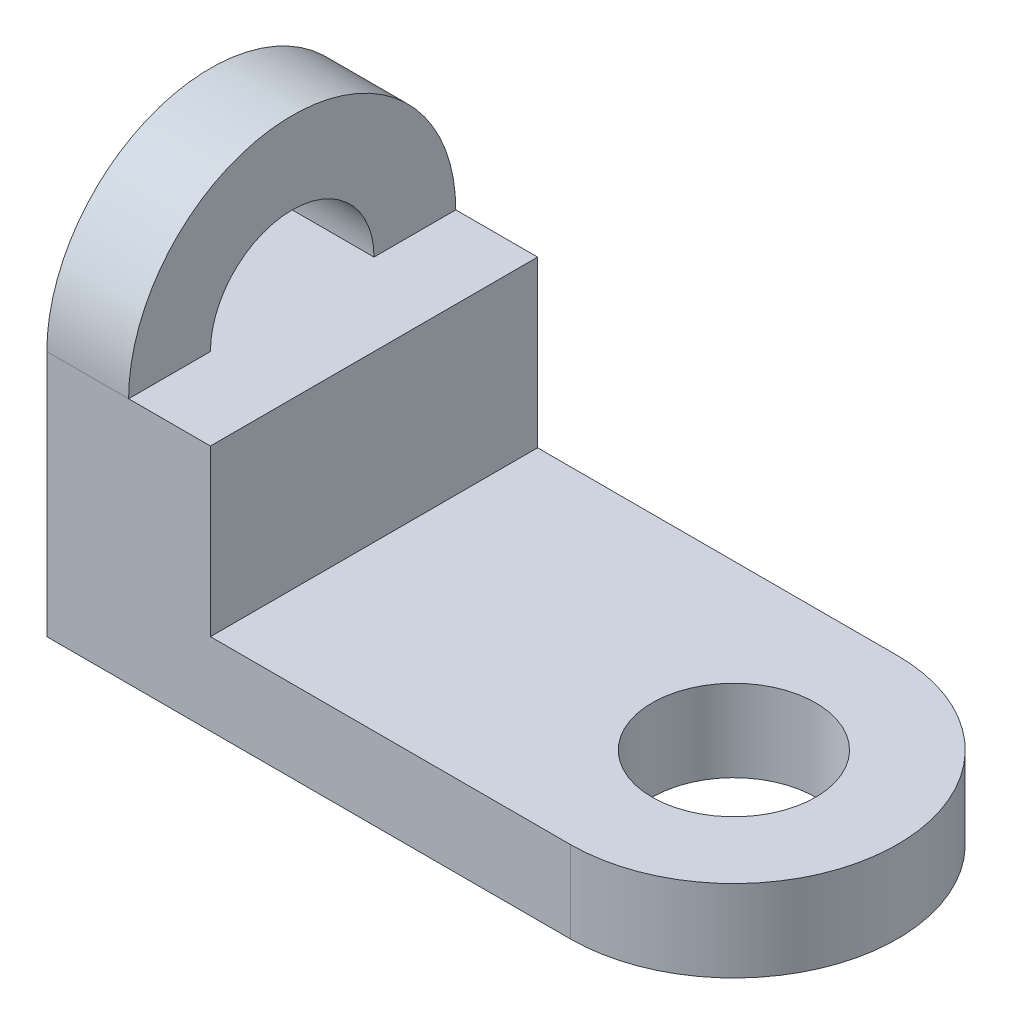
ISO-10303-21;
HEADER;
FILE_DESCRIPTION(('STEP AP214'),'2;1');
FILE_NAME('part.step','',(''),(''),'','','');
FILE_SCHEMA(('AUTOMOTIVE_DESIGN { 1 0 10303 214 1 1 1 1 }'));
ENDSEC;
DATA;
#1=APPLICATION_CONTEXT('core data for automotive mechanical design processes');
#2=APPLICATION_PROTOCOL_DEFINITION('international standard','automotive_design',2000,#1);
#3=PRODUCT_CONTEXT('',#1,'mechanical');
#4=PRODUCT('Part','Part','',(#3));
#5=PRODUCT_RELATED_PRODUCT_CATEGORY('part','',(#4));
#6=PRODUCT_DEFINITION_FORMATION('','',#4);
#7=PRODUCT_DEFINITION_CONTEXT('part definition',#1,'design');
#8=PRODUCT_DEFINITION('design','',#6,#7);
#9=PRODUCT_DEFINITION_SHAPE('','',#8);
#10=(LENGTH_UNIT() NAMED_UNIT(*) SI_UNIT(.MILLI.,.METRE.));
#11=(NAMED_UNIT(*) PLANE_ANGLE_UNIT() SI_UNIT($,.RADIAN.));
#12=(NAMED_UNIT(*) SI_UNIT($,.STERADIAN.) SOLID_ANGLE_UNIT());
#13=UNCERTAINTY_MEASURE_WITH_UNIT(LENGTH_MEASURE(1.E-05),#10,'distance_accuracy_value','');
#14=(GEOMETRIC_REPRESENTATION_CONTEXT(3) GLOBAL_UNCERTAINTY_ASSIGNED_CONTEXT((#13)) GLOBAL_UNIT_ASSIGNED_CONTEXT((#10,
#11,#12)) REPRESENTATION_CONTEXT('',''));
#15=CARTESIAN_POINT('',(0.,0.,0.));
#16=DIRECTION('',(0.,0.,1.));
#17=DIRECTION('',(1.,0.,0.));
#18=AXIS2_PLACEMENT_3D('',#15,#16,#17);
#19=CARTESIAN_POINT('',(0.,766.826,0.));
#20=DIRECTION('',(0.,-1.,0.));
#21=DIRECTION('',(0.,0.,-1.));
#22=AXIS2_PLACEMENT_3D('',#19,#20,#21);
#23=PLANE('',#22);
#24=DIRECTION('',(0.,0.,-1.));
#25=VECTOR('',#24,1.);
#26=CARTESIAN_POINT('',(-1371.6,766.826,2.99760216648792E-13));
#27=LINE('',#26,#25);
#28=CARTESIAN_POINT('',(-1371.6,766.826,508.));
#29=VERTEX_POINT('',#28);
#30=CARTESIAN_POINT('',(-1371.6,766.826,254.));
#31=VERTEX_POINT('',#30);
#32=EDGE_CURVE('E11',#29,#31,#27,.T.);
#33=ORIENTED_EDGE('',*,*,#32,.F.);
#34=DIRECTION('',(1.,0.,0.));
#35=VECTOR('',#34,1.);
#36=CARTESIAN_POINT('',(-1625.6,766.826,508.));
#37=LINE('',#36,#35);
#38=CARTESIAN_POINT('',(-1117.6,766.826,508.));
#39=VERTEX_POINT('',#38);
#40=EDGE_CURVE('E122',#29,#39,#37,.T.);
#41=ORIENTED_EDGE('',*,*,#40,.T.);
#42=DIRECTION('',(0.,0.,1.));
#43=VECTOR('',#42,1.);
#44=CARTESIAN_POINT('',(-1117.6,766.826,-508.));
#45=LINE('',#44,#43);
#46=CARTESIAN_POINT('',(-1117.6,766.826,-508.));
#47=VERTEX_POINT('',#46);
#48=EDGE_CURVE('E132',#47,#39,#45,.T.);
#49=ORIENTED_EDGE('',*,*,#48,.F.);
#50=DIRECTION('',(1.,0.,0.));
#51=VECTOR('',#50,1.);
#52=CARTESIAN_POINT('',(-1625.6,766.826,-508.));
#53=LINE('',#52,#51);
#54=CARTESIAN_POINT('',(-1371.6,766.826,-508.));
#55=VERTEX_POINT('',#54);
#56=EDGE_CURVE('E141',#55,#47,#53,.T.);
#57=ORIENTED_EDGE('',*,*,#56,.F.);
#58=CARTESIAN_POINT('',(-1371.6,766.826,-254.));
#59=VERTEX_POINT('',#58);
#60=EDGE_CURVE('E42',#59,#55,#27,.T.);
#61=ORIENTED_EDGE('',*,*,#60,.F.);
#62=DIRECTION('',(-1.,0.,0.));
#63=VECTOR('',#62,1.);
#64=CARTESIAN_POINT('',(-1371.6,766.826,-254.));
#65=LINE('',#64,#63);
#66=CARTESIAN_POINT('',(-1625.6,766.826,-254.));
#67=VERTEX_POINT('',#66);
#68=EDGE_CURVE('E178',#59,#67,#65,.T.);
#69=ORIENTED_EDGE('',*,*,#68,.T.);
#70=DIRECTION('',(0.,0.,1.));
#71=VECTOR('',#70,1.);
#72=CARTESIAN_POINT('',(-1625.6,766.826,-508.));
#73=LINE('',#72,#71);
#74=CARTESIAN_POINT('',(-1625.6,766.826,254.));
#75=VERTEX_POINT('',#74);
#76=EDGE_CURVE('E121',#67,#75,#73,.T.);
#77=ORIENTED_EDGE('',*,*,#76,.T.);
#78=DIRECTION('',(-1.,0.,0.));
#79=VECTOR('',#78,1.);
#80=CARTESIAN_POINT('',(-1371.6,766.826,254.));
#81=LINE('',#80,#79);
#82=EDGE_CURVE('E37',#75,#31,#81,.F.);
#83=ORIENTED_EDGE('',*,*,#82,.T.);
#84=EDGE_LOOP('',(#33,#41,#49,#57,#61,#69,#77,#83));
#85=FACE_BOUND('',#84,.T.);
#86=ADVANCED_FACE('F33',(#85),#23,.F.);
#87=CARTESIAN_POINT('',(0.,254.,0.));
#88=DIRECTION('',(0.,1.,0.));
#89=DIRECTION('',(0.,0.,1.));
#90=AXIS2_PLACEMENT_3D('',#87,#88,#89);
#91=PLANE('',#90);
#92=CARTESIAN_POINT('',(0.,254.,0.));
#93=DIRECTION('',(0.,1.,0.));
#94=DIRECTION('',(0.,0.,1.));
#95=AXIS2_PLACEMENT_3D('',#92,#93,#94);
#96=CIRCLE('',#95,254.);
#97=CARTESIAN_POINT('',(0.,254.,254.));
#98=VERTEX_POINT('',#97);
#99=EDGE_CURVE('E145',#98,#98,#96,.T.);
#100=ORIENTED_EDGE('',*,*,#99,.F.);
#101=EDGE_LOOP('',(#100));
#102=FACE_BOUND('',#101,.T.);
#103=DIRECTION('',(-1.,0.,0.));
#104=VECTOR('',#103,1.);
#105=CARTESIAN_POINT('',(-1.0796777190076E-13,254.,-508.));
#106=LINE('',#105,#104);
#107=CARTESIAN_POINT('',(-1.0796777190076E-13,254.,-508.));
#108=VERTEX_POINT('',#107);
#109=CARTESIAN_POINT('',(-1117.6,254.,-508.));
#110=VERTEX_POINT('',#109);
#111=EDGE_CURVE('E154',#108,#110,#106,.T.);
#112=ORIENTED_EDGE('',*,*,#111,.T.);
#113=DIRECTION('',(0.,0.,1.));
#114=VECTOR('',#113,1.);
#115=CARTESIAN_POINT('',(-1117.6,254.,-508.));
#116=LINE('',#115,#114);
#117=CARTESIAN_POINT('',(-1117.6,254.,508.));
#118=VERTEX_POINT('',#117);
#119=EDGE_CURVE('E110',#110,#118,#116,.T.);
#120=ORIENTED_EDGE('',*,*,#119,.T.);
#121=DIRECTION('',(1.,0.,0.));
#122=VECTOR('',#121,1.);
#123=CARTESIAN_POINT('',(-1625.6,254.,508.));
#124=LINE('',#123,#122);
#125=CARTESIAN_POINT('',(0.,254.,508.));
#126=VERTEX_POINT('',#125);
#127=EDGE_CURVE('E158',#118,#126,#124,.T.);
#128=ORIENTED_EDGE('',*,*,#127,.T.);
#129=CARTESIAN_POINT('',(0.,254.,0.));
#130=DIRECTION('',(0.,1.,0.));
#131=DIRECTION('',(0.,0.,1.));
#132=AXIS2_PLACEMENT_3D('',#129,#130,#131);
#133=CIRCLE('',#132,508.);
#134=EDGE_CURVE('E151',#126,#108,#133,.T.);
#135=ORIENTED_EDGE('',*,*,#134,.T.);
#136=EDGE_LOOP('',(#112,#120,#128,#135));
#137=FACE_BOUND('',#136,.T.);
#138=ADVANCED_FACE('F194',(#102,#137),#91,.T.);
#139=CARTESIAN_POINT('',(0.,0.,0.));
#140=DIRECTION('',(0.,1.,0.));
#141=DIRECTION('',(0.,0.,1.));
#142=AXIS2_PLACEMENT_3D('',#139,#140,#141);
#143=PLANE('',#142);
#144=DIRECTION('',(0.,0.,1.));
#145=VECTOR('',#144,1.);
#146=CARTESIAN_POINT('',(-1625.6,0.,-508.));
#147=LINE('',#146,#145);
#148=CARTESIAN_POINT('',(-1625.6,0.,-508.));
#149=VERTEX_POINT('',#148);
#150=CARTESIAN_POINT('',(-1625.6,0.,508.));
#151=VERTEX_POINT('',#150);
#152=EDGE_CURVE('E165',#149,#151,#147,.T.);
#153=ORIENTED_EDGE('',*,*,#152,.F.);
#154=DIRECTION('',(-1.,0.,0.));
#155=VECTOR('',#154,1.);
#156=CARTESIAN_POINT('',(-1.0796777190076E-13,0.,-508.));
#157=LINE('',#156,#155);
#158=CARTESIAN_POINT('',(-1.0796777190076E-13,0.,-508.));
#159=VERTEX_POINT('',#158);
#160=EDGE_CURVE('E163',#159,#149,#157,.T.);
#161=ORIENTED_EDGE('',*,*,#160,.F.);
#162=CARTESIAN_POINT('',(0.,0.,0.));
#163=DIRECTION('',(0.,1.,0.));
#164=DIRECTION('',(0.,0.,1.));
#165=AXIS2_PLACEMENT_3D('',#162,#163,#164);
#166=CIRCLE('',#165,508.);
#167=CARTESIAN_POINT('',(0.,0.,508.));
#168=VERTEX_POINT('',#167);
#169=EDGE_CURVE('E148',#168,#159,#166,.T.);
#170=ORIENTED_EDGE('',*,*,#169,.F.);
#171=DIRECTION('',(1.,0.,0.));
#172=VECTOR('',#171,1.);
#173=CARTESIAN_POINT('',(-1625.6,0.,508.));
#174=LINE('',#173,#172);
#175=EDGE_CURVE('E155',#151,#168,#174,.T.);
#176=ORIENTED_EDGE('',*,*,#175,.F.);
#177=EDGE_LOOP('',(#153,#161,#170,#176));
#178=FACE_BOUND('',#177,.T.);
#179=CARTESIAN_POINT('',(0.,0.,0.));
#180=DIRECTION('',(0.,1.,0.));
#181=DIRECTION('',(0.,0.,1.));
#182=AXIS2_PLACEMENT_3D('',#179,#180,#181);
#183=CIRCLE('',#182,254.);
#184=CARTESIAN_POINT('',(0.,0.,254.));
#185=VERTEX_POINT('',#184);
#186=EDGE_CURVE('E143',#185,#185,#183,.T.);
#187=ORIENTED_EDGE('',*,*,#186,.T.);
#188=EDGE_LOOP('',(#187));
#189=FACE_BOUND('',#188,.T.);
#190=ADVANCED_FACE('F203',(#178,#189),#143,.F.);
#191=CARTESIAN_POINT('',(0.,254.,0.));
#192=DIRECTION('',(0.,-1.,0.));
#193=DIRECTION('',(0.,0.,-1.));
#194=AXIS2_PLACEMENT_3D('',#191,#192,#193);
#195=CYLINDRICAL_SURFACE('',#194,508.);
#196=ORIENTED_EDGE('',*,*,#169,.T.);
#197=DIRECTION('',(0.,-1.,0.));
#198=VECTOR('',#197,1.);
#199=CARTESIAN_POINT('',(-1.0796777190076E-13,254.,-508.));
#200=LINE('',#199,#198);
#201=EDGE_CURVE('E175',#108,#159,#200,.T.);
#202=ORIENTED_EDGE('',*,*,#201,.F.);
#203=ORIENTED_EDGE('',*,*,#134,.F.);
#204=DIRECTION('',(0.,-1.,0.));
#205=VECTOR('',#204,1.);
#206=CARTESIAN_POINT('',(0.,254.,508.));
#207=LINE('',#206,#205);
#208=EDGE_CURVE('E160',#126,#168,#207,.T.);
#209=ORIENTED_EDGE('',*,*,#208,.T.);
#210=EDGE_LOOP('',(#196,#202,#203,#209));
#211=FACE_BOUND('',#210,.T.);
#212=ADVANCED_FACE('F35',(#211),#195,.T.);
#213=CARTESIAN_POINT('',(-1.0796777190076E-13,254.,-508.));
#214=DIRECTION('',(0.,0.,1.));
#215=DIRECTION('',(1.,0.,0.));
#216=AXIS2_PLACEMENT_3D('',#213,#214,#215);
#217=PLANE('',#216);
#218=CARTESIAN_POINT('',(-1625.6,766.826,-507.999999999999));
#219=VERTEX_POINT('',#218);
#220=EDGE_CURVE('E133',#219,#55,#53,.T.);
#221=ORIENTED_EDGE('',*,*,#220,.T.);
#222=ORIENTED_EDGE('',*,*,#56,.T.);
#223=DIRECTION('',(0.,-1.,0.));
#224=VECTOR('',#223,1.);
#225=CARTESIAN_POINT('',(-1117.6,766.826,-508.));
#226=LINE('',#225,#224);
#227=EDGE_CURVE('E138',#47,#110,#226,.T.);
#228=ORIENTED_EDGE('',*,*,#227,.T.);
#229=ORIENTED_EDGE('',*,*,#111,.F.);
#230=ORIENTED_EDGE('',*,*,#201,.T.);
#231=ORIENTED_EDGE('',*,*,#160,.T.);
#232=DIRECTION('',(0.,-1.,0.));
#233=VECTOR('',#232,1.);
#234=CARTESIAN_POINT('',(-1625.6,254.,-508.));
#235=LINE('',#234,#233);
#236=EDGE_CURVE('E172',#219,#149,#235,.T.);
#237=ORIENTED_EDGE('',*,*,#236,.F.);
#238=EDGE_LOOP('',(#221,#222,#228,#229,#230,#231,#237));
#239=FACE_BOUND('',#238,.T.);
#240=ADVANCED_FACE('F189',(#239),#217,.F.);
#241=CARTESIAN_POINT('',(-1625.6,254.,-508.));
#242=DIRECTION('',(1.,0.,0.));
#243=DIRECTION('',(0.,0.,-1.));
#244=AXIS2_PLACEMENT_3D('',#241,#242,#243);
#245=PLANE('',#244);
#246=DIRECTION('',(0.,-1.,0.));
#247=VECTOR('',#246,1.);
#248=CARTESIAN_POINT('',(-1625.6,254.,508.));
#249=LINE('',#248,#247);
#250=CARTESIAN_POINT('',(-1625.6,766.826,508.));
#251=VERTEX_POINT('',#250);
#252=EDGE_CURVE('E170',#251,#151,#249,.T.);
#253=ORIENTED_EDGE('',*,*,#252,.F.);
#254=CARTESIAN_POINT('',(-1625.6,766.826,4.66293670342566E-13));
#255=DIRECTION('',(1.,0.,0.));
#256=DIRECTION('',(0.,0.,1.));
#257=AXIS2_PLACEMENT_3D('',#254,#255,#256);
#258=CIRCLE('',#257,508.);
#259=EDGE_CURVE('E111',#219,#251,#258,.T.);
#260=ORIENTED_EDGE('',*,*,#259,.F.);
#261=ORIENTED_EDGE('',*,*,#236,.T.);
#262=ORIENTED_EDGE('',*,*,#152,.T.);
#263=EDGE_LOOP('',(#253,#260,#261,#262));
#264=FACE_BOUND('',#263,.T.);
#265=CARTESIAN_POINT('',(-1625.6,766.826,4.66293670342566E-13));
#266=DIRECTION('',(1.,0.,0.));
#267=DIRECTION('',(0.,0.,-1.));
#268=AXIS2_PLACEMENT_3D('',#265,#266,#267);
#269=CIRCLE('',#268,254.);
#270=EDGE_CURVE('E53',#67,#75,#269,.T.);
#271=ORIENTED_EDGE('',*,*,#270,.T.);
#272=ORIENTED_EDGE('',*,*,#76,.F.);
#273=EDGE_LOOP('',(#271,#272));
#274=FACE_BOUND('',#273,.T.);
#275=ADVANCED_FACE('F181',(#264,#274),#245,.F.);
#276=CARTESIAN_POINT('',(-1625.6,254.,508.));
#277=DIRECTION('',(0.,0.,-1.));
#278=DIRECTION('',(-1.,0.,0.));
#279=AXIS2_PLACEMENT_3D('',#276,#277,#278);
#280=PLANE('',#279);
#281=ORIENTED_EDGE('',*,*,#175,.T.);
#282=ORIENTED_EDGE('',*,*,#208,.F.);
#283=ORIENTED_EDGE('',*,*,#127,.F.);
#284=DIRECTION('',(0.,-1.,0.));
#285=VECTOR('',#284,1.);
#286=CARTESIAN_POINT('',(-1117.6,766.826,508.));
#287=LINE('',#286,#285);
#288=EDGE_CURVE('E130',#39,#118,#287,.T.);
#289=ORIENTED_EDGE('',*,*,#288,.F.);
#290=ORIENTED_EDGE('',*,*,#40,.F.);
#291=EDGE_CURVE('E114',#251,#29,#37,.T.);
#292=ORIENTED_EDGE('',*,*,#291,.F.);
#293=ORIENTED_EDGE('',*,*,#252,.T.);
#294=EDGE_LOOP('',(#281,#282,#283,#289,#290,#292,#293));
#295=FACE_BOUND('',#294,.T.);
#296=ADVANCED_FACE('F128',(#295),#280,.F.);
#297=CARTESIAN_POINT('',(0.,254.,0.));
#298=DIRECTION('',(0.,-1.,0.));
#299=DIRECTION('',(0.,0.,-1.));
#300=AXIS2_PLACEMENT_3D('',#297,#298,#299);
#301=CYLINDRICAL_SURFACE('',#300,254.);
#302=ORIENTED_EDGE('',*,*,#99,.T.);
#303=EDGE_LOOP('',(#302));
#304=FACE_BOUND('',#303,.T.);
#305=ORIENTED_EDGE('',*,*,#186,.F.);
#306=EDGE_LOOP('',(#305));
#307=FACE_BOUND('',#306,.T.);
#308=ADVANCED_FACE('F212',(#304,#307),#301,.F.);
#309=CARTESIAN_POINT('',(-1117.6,766.826,-508.));
#310=DIRECTION('',(1.,0.,0.));
#311=DIRECTION('',(0.,0.,-1.));
#312=AXIS2_PLACEMENT_3D('',#309,#310,#311);
#313=PLANE('',#312);
#314=ORIENTED_EDGE('',*,*,#119,.F.);
#315=ORIENTED_EDGE('',*,*,#227,.F.);
#316=ORIENTED_EDGE('',*,*,#48,.T.);
#317=ORIENTED_EDGE('',*,*,#288,.T.);
#318=EDGE_LOOP('',(#314,#315,#316,#317));
#319=FACE_BOUND('',#318,.T.);
#320=ADVANCED_FACE('F192',(#319),#313,.T.);
#321=CARTESIAN_POINT('',(-1371.6,766.826,4.10782519111308E-13));
#322=DIRECTION('',(-1.,0.,0.));
#323=DIRECTION('',(0.,0.,1.));
#324=AXIS2_PLACEMENT_3D('',#321,#322,#323);
#325=PLANE('',#324);
#326=CARTESIAN_POINT('',(-1371.6,766.826,4.10782519111308E-13));
#327=DIRECTION('',(1.,0.,0.));
#328=DIRECTION('',(0.,0.,1.));
#329=AXIS2_PLACEMENT_3D('',#326,#327,#328);
#330=CIRCLE('',#329,508.);
#331=EDGE_CURVE('E102',#55,#29,#330,.T.);
#332=ORIENTED_EDGE('',*,*,#331,.T.);
#333=ORIENTED_EDGE('',*,*,#32,.T.);
#334=CARTESIAN_POINT('',(-1371.6,766.826,4.10782519111308E-13));
#335=DIRECTION('',(1.,0.,0.));
#336=DIRECTION('',(0.,0.,-1.));
#337=AXIS2_PLACEMENT_3D('',#334,#335,#336);
#338=CIRCLE('',#337,254.);
#339=EDGE_CURVE('E49',#59,#31,#338,.T.);
#340=ORIENTED_EDGE('',*,*,#339,.F.);
#341=ORIENTED_EDGE('',*,*,#60,.T.);
#342=EDGE_LOOP('',(#332,#333,#340,#341));
#343=FACE_BOUND('',#342,.T.);
#344=ADVANCED_FACE('F104',(#343),#325,.F.);
#345=CARTESIAN_POINT('',(-1371.6,766.826,4.10782519111308E-13));
#346=DIRECTION('',(-1.,0.,0.));
#347=DIRECTION('',(0.,0.,1.));
#348=AXIS2_PLACEMENT_3D('',#345,#346,#347);
#349=CYLINDRICAL_SURFACE('',#348,254.);
#350=ORIENTED_EDGE('',*,*,#82,.F.);
#351=ORIENTED_EDGE('',*,*,#270,.F.);
#352=ORIENTED_EDGE('',*,*,#68,.F.);
#353=ORIENTED_EDGE('',*,*,#339,.T.);
#354=EDGE_LOOP('',(#350,#351,#352,#353));
#355=FACE_BOUND('',#354,.T.);
#356=ADVANCED_FACE('F292',(#355),#349,.F.);
#357=CARTESIAN_POINT('',(-1371.6,766.826,4.10782519111308E-13));
#358=DIRECTION('',(-1.,0.,0.));
#359=DIRECTION('',(0.,0.,1.));
#360=AXIS2_PLACEMENT_3D('',#357,#358,#359);
#361=CYLINDRICAL_SURFACE('',#360,508.);
#362=ORIENTED_EDGE('',*,*,#259,.T.);
#363=ORIENTED_EDGE('',*,*,#291,.T.);
#364=ORIENTED_EDGE('',*,*,#331,.F.);
#365=ORIENTED_EDGE('',*,*,#220,.F.);
#366=EDGE_LOOP('',(#362,#363,#364,#365));
#367=FACE_BOUND('',#366,.T.);
#368=ADVANCED_FACE('F115',(#367),#361,.T.);
#369=CLOSED_SHELL('',(#86,#138,#190,#212,#240,#275,#296,#308,#320,#344,#356,#368));
#370=MANIFOLD_SOLID_BREP('B2',#369);
#371=ADVANCED_BREP_SHAPE_REPRESENTATION('',(#18,#370),#14);
#372=SHAPE_DEFINITION_REPRESENTATION(#9,#371);
ENDSEC;
END-ISO-10303-21;
